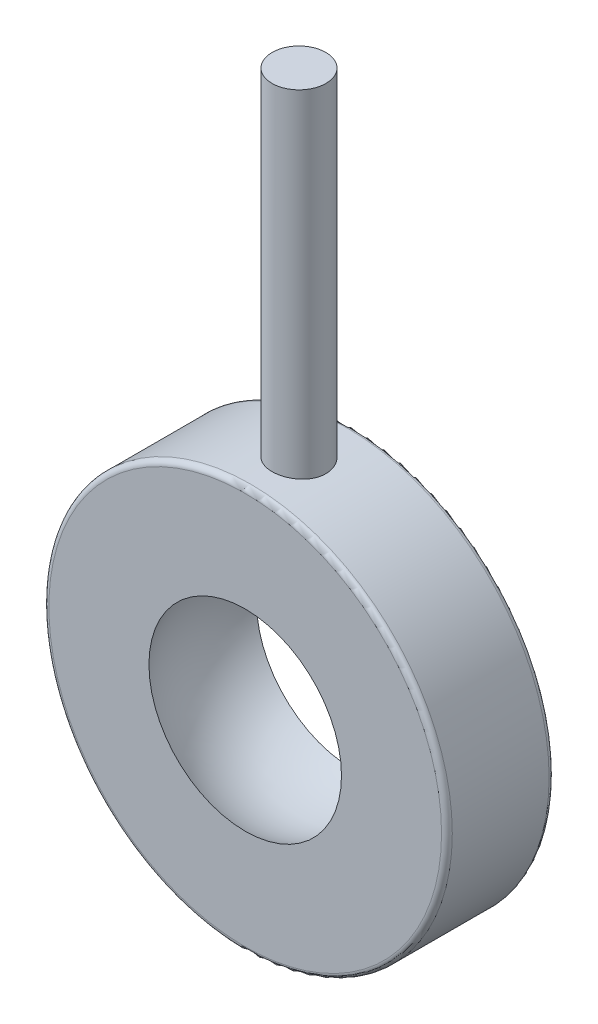
ISO-10303-21;
HEADER;
FILE_DESCRIPTION(('STEP AP214'),'2;1');
FILE_NAME('part.step','',(''),(''),'','','');
FILE_SCHEMA(('AUTOMOTIVE_DESIGN { 1 0 10303 214 1 1 1 1 }'));
ENDSEC;
DATA;
#1=APPLICATION_CONTEXT('core data for automotive mechanical design processes');
#2=APPLICATION_PROTOCOL_DEFINITION('international standard','automotive_design',2000,#1);
#3=PRODUCT_CONTEXT('',#1,'mechanical');
#4=PRODUCT('Part','Part','',(#3));
#5=PRODUCT_RELATED_PRODUCT_CATEGORY('part','',(#4));
#6=PRODUCT_DEFINITION_FORMATION('','',#4);
#7=PRODUCT_DEFINITION_CONTEXT('part definition',#1,'design');
#8=PRODUCT_DEFINITION('design','',#6,#7);
#9=PRODUCT_DEFINITION_SHAPE('','',#8);
#10=(LENGTH_UNIT() NAMED_UNIT(*) SI_UNIT(.MILLI.,.METRE.));
#11=(NAMED_UNIT(*) PLANE_ANGLE_UNIT() SI_UNIT($,.RADIAN.));
#12=(NAMED_UNIT(*) SI_UNIT($,.STERADIAN.) SOLID_ANGLE_UNIT());
#13=UNCERTAINTY_MEASURE_WITH_UNIT(LENGTH_MEASURE(1.E-05),#10,'distance_accuracy_value','');
#14=(GEOMETRIC_REPRESENTATION_CONTEXT(3) GLOBAL_UNCERTAINTY_ASSIGNED_CONTEXT((#13)) GLOBAL_UNIT_ASSIGNED_CONTEXT((#10,
#11,#12)) REPRESENTATION_CONTEXT('',''));
#15=CARTESIAN_POINT('',(0.,0.,0.));
#16=DIRECTION('',(0.,0.,1.));
#17=DIRECTION('',(1.,0.,0.));
#18=AXIS2_PLACEMENT_3D('',#15,#16,#17);
#19=CARTESIAN_POINT('',(0.,0.,20.));
#20=DIRECTION('',(0.,0.,-1.));
#21=DIRECTION('',(-1.,0.,0.));
#22=AXIS2_PLACEMENT_3D('',#19,#20,#21);
#23=CYLINDRICAL_SURFACE('',#22,75.);
#24=CARTESIAN_POINT('',(0.,0.,18.));
#25=DIRECTION('',(0.,0.,1.));
#26=DIRECTION('',(1.,0.,0.));
#27=AXIS2_PLACEMENT_3D('',#24,#25,#26);
#28=CIRCLE('',#27,75.);
#29=CARTESIAN_POINT('',(75.,0.,18.));
#30=VERTEX_POINT('',#29);
#31=EDGE_CURVE('E47',#30,#30,#28,.F.);
#32=ORIENTED_EDGE('',*,*,#31,.T.);
#33=EDGE_LOOP('',(#32));
#34=FACE_BOUND('',#33,.T.);
#35=CARTESIAN_POINT('',(0.,0.,-18.));
#36=DIRECTION('',(0.,0.,1.));
#37=DIRECTION('',(1.,0.,0.));
#38=AXIS2_PLACEMENT_3D('',#35,#36,#37);
#39=CIRCLE('',#38,75.);
#40=CARTESIAN_POINT('',(75.,0.,-18.));
#41=VERTEX_POINT('',#40);
#42=EDGE_CURVE('E51',#41,#41,#39,.T.);
#43=ORIENTED_EDGE('',*,*,#42,.T.);
#44=EDGE_LOOP('',(#43));
#45=FACE_BOUND('',#44,.T.);
#46=CARTESIAN_POINT('',(0.,75.,-10.));
#47=CARTESIAN_POINT('',(-0.279619716406535,75.0000012070515,-10.0000033923977));
#48=CARTESIAN_POINT('',(-0.559190351759265,74.9984332083861,-9.98826782734136));
#49=CARTESIAN_POINT('',(-1.11641921688895,74.9922076081366,-9.94141688074488));
#50=CARTESIAN_POINT('',(-1.39407700909204,74.9875493218885,-9.90629631817048));
#51=CARTESIAN_POINT('',(-1.94565039617829,74.9752668061268,-9.81288776594244));
#52=CARTESIAN_POINT('',(-2.21956240482985,74.9676399156737,-9.7545789902689));
#53=CARTESIAN_POINT('',(-2.76145578336895,74.9496354658181,-9.61522890265368));
#54=CARTESIAN_POINT('',(-3.02943703069307,74.9392578496273,-9.53418712139056));
#55=CARTESIAN_POINT('',(-3.55737734335785,74.916051954278,-9.35003582899592));
#56=CARTESIAN_POINT('',(-3.81734207530547,74.9032254545217,-9.24694233452308));
#57=CARTESIAN_POINT('',(-4.32763808166604,74.8754756289206,-9.0194009843396));
#58=CARTESIAN_POINT('',(-4.57796923253956,74.8605522761976,-8.89495285489238));
#59=CARTESIAN_POINT('',(-5.06721394197359,74.8290279942424,-8.62561909731318));
#60=CARTESIAN_POINT('',(-5.30612952593188,74.8124273642399,-8.48073711280309));
#61=CARTESIAN_POINT('',(-5.77094557458623,74.778008183031,-8.1715422272001));
#62=CARTESIAN_POINT('',(-5.99684595323996,74.7601896237748,-8.00722919767223));
#63=CARTESIAN_POINT('',(-6.43529763931791,74.7237285992153,-7.65935333014741));
#64=CARTESIAN_POINT('',(-6.6477676383944,74.7050820997237,-7.47568842837199));
#65=CARTESIAN_POINT('',(-7.05650448635232,74.6675824863102,-7.0911549335543));
#66=CARTESIAN_POINT('',(-7.2527712655371,74.6487293715,-6.89028626651918));
#67=CARTESIAN_POINT('',(-7.62774757858985,74.6113461986771,-6.47272832337968));
#68=CARTESIAN_POINT('',(-7.80645599031184,74.5928161613743,-6.25603803766469));
#69=CARTESIAN_POINT('',(-8.14504497656681,74.5566042763688,-5.80835655567108));
#70=CARTESIAN_POINT('',(-8.30492598085652,74.5389224093111,-5.57736568600307));
#71=CARTESIAN_POINT('',(-8.60531438636342,74.504842207492,-5.10176217616923));
#72=CARTESIAN_POINT('',(-8.74574434387781,74.4884491098742,-4.85710023717615));
#73=CARTESIAN_POINT('',(-9.00547981792014,74.4574942412595,-4.35669598140822));
#74=CARTESIAN_POINT('',(-9.12478526319585,74.4429324764397,-4.10095362726314));
#75=CARTESIAN_POINT('',(-9.34139305270841,74.4160620748674,-3.5802089413552));
#76=CARTESIAN_POINT('',(-9.43869613581775,74.4037533624565,-3.31520692089105));
#77=CARTESIAN_POINT('',(-9.61058011027943,74.3817468534644,-2.77782799611837));
#78=CARTESIAN_POINT('',(-9.68516114799469,74.3720490400652,-2.50545113932678));
#79=CARTESIAN_POINT('',(-9.81066575440311,74.3555971239215,-1.95691776019522));
#80=CARTESIAN_POINT('',(-9.86172720998308,74.348825878578,-1.68079329735067));
#81=CARTESIAN_POINT('',(-9.94045852889622,74.3383404807451,-1.12517177066657));
#82=CARTESIAN_POINT('',(-9.96812847535401,74.334626317392,-0.845674718815502));
#83=CARTESIAN_POINT('',(-9.99986657015993,74.3303634208185,-0.285330967482586));
#84=CARTESIAN_POINT('',(-10.003935670207,74.3298145599579,-0.0044843228798482));
#85=CARTESIAN_POINT('',(-9.9884436303598,74.3318979618101,0.556544013741018));
#86=CARTESIAN_POINT('',(-9.96888257352402,74.3345302133413,0.836725708092934));
#87=CARTESIAN_POINT('',(-9.90648350629231,74.3428716448243,1.39258506553653));
#88=CARTESIAN_POINT('',(-9.86379816927264,74.3485606412444,1.66828018702316));
#89=CARTESIAN_POINT('',(-9.75556991491202,74.362839042772,2.21506836510023));
#90=CARTESIAN_POINT('',(-9.69002711247965,74.3714284332987,2.48616144481877));
#91=CARTESIAN_POINT('',(-9.53656626884383,74.3912621428144,3.02184245400225));
#92=CARTESIAN_POINT('',(-9.44864787014626,74.4025065042216,3.2864302794589));
#93=CARTESIAN_POINT('',(-9.25107692739361,74.4273301969514,3.80724947764055));
#94=CARTESIAN_POINT('',(-9.14142428052967,74.4409095393191,4.06348081083043));
#95=CARTESIAN_POINT('',(-8.90079707415186,74.4700646992385,4.56659736655158));
#96=CARTESIAN_POINT('',(-8.76975689821135,74.4856466283773,4.81345085037148));
#97=CARTESIAN_POINT('',(-8.48753376903345,74.51833291186,5.29525425098687));
#98=CARTESIAN_POINT('',(-8.33635078936688,74.5354372682015,5.53020415216323));
#99=CARTESIAN_POINT('',(-8.01489842453545,74.5706881907582,5.98659441102554));
#100=CARTESIAN_POINT('',(-7.84462820048524,74.5888348027634,6.20803417427924));
#101=CARTESIAN_POINT('',(-7.48619078801042,74.6256617756626,6.63587446530522));
#102=CARTESIAN_POINT('',(-7.29802350511339,74.6443421393736,6.84227491367997));
#103=CARTESIAN_POINT('',(-6.90353914836961,74.6818632648854,7.24018307572474));
#104=CARTESIAN_POINT('',(-6.69709064011064,74.7007041298098,7.43156050097077));
#105=CARTESIAN_POINT('',(-6.26877092927642,74.7378666401358,7.79625726007098));
#106=CARTESIAN_POINT('',(-6.04689964094186,74.7561882826494,7.9695764934981));
#107=CARTESIAN_POINT('',(-5.58927967789114,74.7917950905406,8.29693299256007));
#108=CARTESIAN_POINT('',(-5.35353091917046,74.8090802496428,8.45097014145701));
#109=CARTESIAN_POINT('',(-4.86980533586423,74.8421255450883,8.73866033207255));
#110=CARTESIAN_POINT('',(-4.62182853870506,74.8578856848517,8.87231341950802));
#111=CARTESIAN_POINT('',(-4.11528292267449,74.8874410646486,9.11831979126875));
#112=CARTESIAN_POINT('',(-3.85670971755911,74.901235480199,9.23066414458084));
#113=CARTESIAN_POINT('',(-3.33090046417497,74.9264597562814,9.43315807583885));
#114=CARTESIAN_POINT('',(-3.06366440566221,74.9378896140173,9.52330762753788));
#115=CARTESIAN_POINT('',(-2.52245103799736,74.9580586777726,9.68073658847149));
#116=CARTESIAN_POINT('',(-2.2484740229211,74.9667980009434,9.74801699348767));
#117=CARTESIAN_POINT('',(-1.69574122707741,74.9813369193078,9.85920529988417));
#118=CARTESIAN_POINT('',(-1.41698547825027,74.987136534142,9.90311335741876));
#119=CARTESIAN_POINT('',(-0.85884171502717,74.9955978558703,9.96698012875527));
#120=CARTESIAN_POINT('',(-0.579474551480974,74.9982830412201,9.98711805685234));
#121=CARTESIAN_POINT('',(-0.0200236329046552,75.0005189604191,10.0038949721797));
#122=CARTESIAN_POINT('',(0.260060118508236,75.0000697100594,10.0005340777956));
#123=CARTESIAN_POINT('',(0.818929906214981,74.9960495081665,9.97033922625838));
#124=CARTESIAN_POINT('',(1.09771597241429,74.9924786289335,9.94350581275431));
#125=CARTESIAN_POINT('',(1.65200207000453,74.9823160890031,9.86656866179517));
#126=CARTESIAN_POINT('',(1.92750210349212,74.9757244302332,9.81646493918856));
#127=CARTESIAN_POINT('',(2.47222254979644,74.9597364320507,9.6935946220001));
#128=CARTESIAN_POINT('',(2.7414627366857,74.9503507705404,9.62091426388232));
#129=CARTESIAN_POINT('',(3.27284235726101,74.9290278451886,9.45336512583319));
#130=CARTESIAN_POINT('',(3.53498181499396,74.9170905899896,9.35849642105403));
#131=CARTESIAN_POINT('',(4.05029728746842,74.8909984472783,9.14727405572724));
#132=CARTESIAN_POINT('',(4.30347457729918,74.8768438768012,9.03092346626723));
#133=CARTESIAN_POINT('',(4.79924236531035,74.8467031833699,8.77751678752504));
#134=CARTESIAN_POINT('',(5.04182912273535,74.8307164203677,8.64045345720924));
#135=CARTESIAN_POINT('',(5.51599422388902,74.7972634767049,8.34578711139781));
#136=CARTESIAN_POINT('',(5.74750256409731,74.7797894418158,8.1880723364509));
#137=CARTESIAN_POINT('',(6.19643401690767,74.7439290076531,7.85382215730966));
#138=CARTESIAN_POINT('',(6.41385704482018,74.7255426028952,7.67728663997033));
#139=CARTESIAN_POINT('',(6.83316221015274,74.6883673285822,7.30658738718975));
#140=CARTESIAN_POINT('',(7.0350410398467,74.6695783744481,7.11241991881148));
#141=CARTESIAN_POINT('',(7.42174467379806,74.6321340967488,6.70790376909727));
#142=CARTESIAN_POINT('',(7.60657530820146,74.6134787295277,6.49756066497197));
#143=CARTESIAN_POINT('',(7.95915417081043,74.5766954352973,6.06062667526092));
#144=CARTESIAN_POINT('',(8.12677983770482,74.5585718721111,5.83393650085427));
#145=CARTESIAN_POINT('',(8.44233678865546,74.5235007396666,5.36715158120608));
#146=CARTESIAN_POINT('',(8.59026797439738,74.506553176279,5.12705676905743));
#147=CARTESIAN_POINT('',(8.86536998117221,74.4743204414776,4.6351511556));
#148=CARTESIAN_POINT('',(8.99254112251892,74.4590352444159,4.38334053513548));
#149=CARTESIAN_POINT('',(9.22519828092124,74.4305680562507,3.86977833159328));
#150=CARTESIAN_POINT('',(9.3306844004032,74.4173860552131,3.60802679547712));
#151=CARTESIAN_POINT('',(9.518916022133,74.3935428577647,3.07722298243401));
#152=CARTESIAN_POINT('',(9.60172718392501,74.3828743957286,2.80819431788257));
#153=CARTESIAN_POINT('',(9.74439916306694,74.3643185033919,2.26402367489205));
#154=CARTESIAN_POINT('',(9.80426000847051,74.3564310696919,1.9888817039261));
#155=CARTESIAN_POINT('',(9.90057777843488,74.3436676787331,1.43447451357626));
#156=CARTESIAN_POINT('',(9.93703575499221,74.3387915861101,1.15520948010803));
#157=CARTESIAN_POINT('',(9.98627459257247,74.3321931580462,0.594563303608569));
#158=CARTESIAN_POINT('',(9.99905559074115,74.3304708043377,0.313182172844039));
#159=CARTESIAN_POINT('',(10.000836439396,74.330231194586,-0.247427146871469));
#160=CARTESIAN_POINT('',(9.99002372423676,74.3316886771164,-0.526654747900826));
#161=CARTESIAN_POINT('',(9.94508084096933,74.3377150547088,-1.08319182065992));
#162=CARTESIAN_POINT('',(9.91095080408146,74.3422839322611,-1.36050130317516));
#163=CARTESIAN_POINT('',(9.81962911533225,74.3544013589413,-1.91122852119838));
#164=CARTESIAN_POINT('',(9.76243754406853,74.3619498976554,-2.18464627030409));
#165=CARTESIAN_POINT('',(9.62541751382016,74.3798097942894,-2.72565680122852));
#166=CARTESIAN_POINT('',(9.54558900448568,74.3901211583543,-2.99324957008969));
#167=CARTESIAN_POINT('',(9.36392490111063,74.4132063711849,-3.52060365753774));
#168=CARTESIAN_POINT('',(9.26209981768597,74.4259790435507,-3.78036864915102));
#169=CARTESIAN_POINT('',(9.03715761064697,74.4536272750217,-4.29039200716886));
#170=CARTESIAN_POINT('',(8.91404050976295,74.468502831882,-4.54065038372189));
#171=CARTESIAN_POINT('',(8.64742107822786,74.4999336482931,-5.02988078737508));
#172=CARTESIAN_POINT('',(8.50392307410038,74.5164885511344,-5.26885519556255));
#173=CARTESIAN_POINT('',(8.19746322335711,74.5508240822604,-5.73403968531539));
#174=CARTESIAN_POINT('',(8.03449265102683,74.5686052585214,-5.96024397719729));
#175=CARTESIAN_POINT('',(7.68896377124455,74.6050282016065,-6.39989043135431));
#176=CARTESIAN_POINT('',(7.50626610717593,74.6236754785316,-6.61322262770322));
#177=CARTESIAN_POINT('',(7.12367161173551,74.6611694400287,-7.02367299975107));
#178=CARTESIAN_POINT('',(6.92378206982238,74.680016037144,-7.22079797873578));
#179=CARTESIAN_POINT('',(6.50803092991312,74.7173949161725,-7.59764996818853));
#180=CARTESIAN_POINT('',(6.29216212142672,74.7359270514941,-7.77736903892833));
#181=CARTESIAN_POINT('',(5.84603335633378,74.7721470132355,-8.11804572582927));
#182=CARTESIAN_POINT('',(5.61577358197094,74.7898348503422,-8.27900357950396));
#183=CARTESIAN_POINT('',(5.14142898395728,74.8239432381203,-8.58167832911045));
#184=CARTESIAN_POINT('',(4.8972884105166,74.8403579452544,-8.72330853716676));
#185=CARTESIAN_POINT('',(4.39782524224943,74.8713679221156,-8.9854707031445));
#186=CARTESIAN_POINT('',(4.14250280390369,74.8859632172929,-9.10600295619614));
#187=CARTESIAN_POINT('',(3.62271944611508,74.9129063510595,-9.32498517527485));
#188=CARTESIAN_POINT('',(3.35826739233886,74.9252563008749,-9.42345590549698));
#189=CARTESIAN_POINT('',(2.82197823359799,74.9473715001512,-9.59770504733728));
#190=CARTESIAN_POINT('',(2.55014285896011,74.9571373495462,-9.67348872660158));
#191=CARTESIAN_POINT('',(1.9030986725915,74.9767750395936,-9.8246822567323));
#192=CARTESIAN_POINT('',(1.52553616139415,74.9854472385771,-9.89035696515225));
#193=CARTESIAN_POINT('',(0.765285107177902,74.9970588677068,-9.97801332321165));
#194=CARTESIAN_POINT('',(0.38259660940573,74.9999983484219,-9.99999535826768));
#195=CARTESIAN_POINT('',(0.,75.,-10.));
#196=B_SPLINE_CURVE_WITH_KNOTS('',3,(#46,#47,#48,#49,#50,#51,#52,#53,#54,#55,#56,#57,#58,#59,
#60,#61,#62,#63,#64,#65,#66,#67,#68,#69,#70,#71,#72,#73,#74,#75,#76,#77,#78,#79,#80,#81,#82,#83,
#84,#85,#86,#87,#88,#89,#90,#91,#92,#93,#94,#95,#96,#97,#98,#99,#100,#101,#102,#103,#104,#105,
#106,#107,#108,#109,#110,#111,#112,#113,#114,#115,#116,#117,#118,#119,#120,#121,#122,#123,#124,
#125,#126,#127,#128,#129,#130,#131,#132,#133,#134,#135,#136,#137,#138,#139,#140,#141,#142,#143,
#144,#145,#146,#147,#148,#149,#150,#151,#152,#153,#154,#155,#156,#157,#158,#159,#160,#161,#162,
#163,#164,#165,#166,#167,#168,#169,#170,#171,#172,#173,#174,#175,#176,#177,#178,#179,#180,#181,
#182,#183,#184,#185,#186,#187,#188,#189,#190,#191,#192,#193,#194,#195),.UNSPECIFIED.,.T.,.F.,(4,
2,2,2,2,2,2,2,2,2,2,2,2,2,2,2,2,2,2,2,2,2,2,2,2,2,2,2,2,2,2,2,2,2,2,2,2,2,2,2,2,2,2,2,2,2,2,2,2,
2,2,2,2,2,2,2,2,2,2,2,2,2,2,2,2,2,2,2,2,2,2,2,2,2,4),(0.,0.838524241119911,1.67723432228739,
2.51669792781775,3.35617886529557,4.19505212671737,5.03393614212582,5.87267076228796,
6.71141092661273,7.55481999152266,8.39823268409013,9.24169924370328,10.0851465465111,
10.931860991401,11.7785782921742,12.6252671546797,13.4719505631659,14.3136049321686,
15.1552563102355,15.9968737486607,16.8384882288647,17.6746126613095,18.5107328904676,
19.346866479128,20.1830040230207,21.0217567769291,21.8605106313672,22.6993013635423,
23.5380965236507,24.3835068143974,25.2289218064754,26.0743419166322,26.9197601306742,
27.7655319010118,28.6113046715277,29.4570406101976,30.3027708983041,31.1420832473239,
31.9813913679424,32.8206800497891,33.6599681960984,34.4960891183103,35.3322072086111,
36.1682058584401,37.0044974467368,37.8455178536597,38.6865433168455,39.5277472541784,
40.3686624414341,41.2152036830642,42.0617491504474,42.9082815549571,43.7548099608906,
44.598860521096,45.4429100495603,46.2869216339858,47.1309283295713,47.9682544521221,
48.8055758625855,49.6428943467248,50.4802146932709,51.3171358248189,52.1540560629157,
52.9907989017062,53.8279181035595,54.6713946664566,55.5145153369487,56.3580188043681,
57.2015115920288,58.0486712842236,58.8958191249191,59.7421662530566,60.5883167174148,
61.7356584201595,62.8829900020661),.UNSPECIFIED.);
#197=CARTESIAN_POINT('',(0.,75.,-10.));
#198=VERTEX_POINT('',#197);
#199=EDGE_CURVE('E59',#198,#198,#196,.T.);
#200=ORIENTED_EDGE('',*,*,#199,.F.);
#201=EDGE_LOOP('',(#200));
#202=FACE_BOUND('',#201,.T.);
#203=ADVANCED_FACE('F39',(#34,#45,#202),#23,.T.);
#204=CARTESIAN_POINT('',(0.,0.,20.));
#205=DIRECTION('',(0.,0.,1.));
#206=DIRECTION('',(1.,0.,0.));
#207=AXIS2_PLACEMENT_3D('',#204,#205,#206);
#208=PLANE('',#207);
#209=CARTESIAN_POINT('',(0.,0.,20.));
#210=DIRECTION('',(0.,0.,1.));
#211=DIRECTION('',(1.,0.,0.));
#212=AXIS2_PLACEMENT_3D('',#209,#210,#211);
#213=CIRCLE('',#212,35.7967879145601);
#214=CARTESIAN_POINT('',(35.7967879145601,0.,20.));
#215=VERTEX_POINT('',#214);
#216=EDGE_CURVE('E120',#215,#215,#213,.F.);
#217=ORIENTED_EDGE('',*,*,#216,.T.);
#218=EDGE_LOOP('',(#217));
#219=FACE_BOUND('',#218,.T.);
#220=CARTESIAN_POINT('',(0.,0.,20.));
#221=DIRECTION('',(0.,0.,1.));
#222=DIRECTION('',(1.,0.,0.));
#223=AXIS2_PLACEMENT_3D('',#220,#221,#222);
#224=CIRCLE('',#223,73.);
#225=CARTESIAN_POINT('',(73.,0.,20.));
#226=VERTEX_POINT('',#225);
#227=EDGE_CURVE('E56',#226,#226,#224,.T.);
#228=ORIENTED_EDGE('',*,*,#227,.T.);
#229=EDGE_LOOP('',(#228));
#230=FACE_BOUND('',#229,.T.);
#231=ADVANCED_FACE('F80',(#219,#230),#208,.T.);
#232=CARTESIAN_POINT('',(0.,0.,-20.));
#233=DIRECTION('',(0.,0.,1.));
#234=DIRECTION('',(1.,0.,0.));
#235=AXIS2_PLACEMENT_3D('',#232,#233,#234);
#236=PLANE('',#235);
#237=CARTESIAN_POINT('',(0.,0.,-20.));
#238=DIRECTION('',(0.,0.,1.));
#239=DIRECTION('',(1.,0.,0.));
#240=AXIS2_PLACEMENT_3D('',#237,#238,#239);
#241=CIRCLE('',#240,35.7967879145601);
#242=CARTESIAN_POINT('',(35.7967879145601,0.,-20.));
#243=VERTEX_POINT('',#242);
#244=EDGE_CURVE('E43',#243,#243,#241,.F.);
#245=ORIENTED_EDGE('',*,*,#244,.F.);
#246=EDGE_LOOP('',(#245));
#247=FACE_BOUND('',#246,.T.);
#248=CARTESIAN_POINT('',(0.,0.,-20.));
#249=DIRECTION('',(0.,0.,1.));
#250=DIRECTION('',(1.,0.,0.));
#251=AXIS2_PLACEMENT_3D('',#248,#249,#250);
#252=CIRCLE('',#251,73.);
#253=CARTESIAN_POINT('',(73.,0.,-20.));
#254=VERTEX_POINT('',#253);
#255=EDGE_CURVE('E10',#254,#254,#252,.F.);
#256=ORIENTED_EDGE('',*,*,#255,.T.);
#257=EDGE_LOOP('',(#256));
#258=FACE_BOUND('',#257,.T.);
#259=ADVANCED_FACE('F77',(#247,#258),#236,.F.);
#260=CARTESIAN_POINT('',(0.,200.,0.));
#261=DIRECTION('',(0.,-1.,0.));
#262=DIRECTION('',(0.,0.,-1.));
#263=AXIS2_PLACEMENT_3D('',#260,#261,#262);
#264=CYLINDRICAL_SURFACE('',#263,10.);
#265=CARTESIAN_POINT('',(0.,200.,0.));
#266=DIRECTION('',(0.,1.,0.));
#267=DIRECTION('',(0.,0.,1.));
#268=AXIS2_PLACEMENT_3D('',#265,#266,#267);
#269=CIRCLE('',#268,10.);
#270=CARTESIAN_POINT('',(0.,200.,10.));
#271=VERTEX_POINT('',#270);
#272=EDGE_CURVE('E67',#271,#271,#269,.T.);
#273=ORIENTED_EDGE('',*,*,#272,.F.);
#274=EDGE_LOOP('',(#273));
#275=FACE_BOUND('',#274,.T.);
#276=ORIENTED_EDGE('',*,*,#199,.T.);
#277=EDGE_LOOP('',(#276));
#278=FACE_BOUND('',#277,.T.);
#279=ADVANCED_FACE('F71',(#275,#278),#264,.T.);
#280=CARTESIAN_POINT('',(0.,200.,0.));
#281=DIRECTION('',(0.,1.,0.));
#282=DIRECTION('',(0.,0.,1.));
#283=AXIS2_PLACEMENT_3D('',#280,#281,#282);
#284=PLANE('',#283);
#285=ORIENTED_EDGE('',*,*,#272,.T.);
#286=EDGE_LOOP('',(#285));
#287=FACE_BOUND('',#286,.T.);
#288=ADVANCED_FACE('F76',(#287),#284,.T.);
#289=CARTESIAN_POINT('',(0.,0.,18.));
#290=DIRECTION('',(0.,0.,1.));
#291=DIRECTION('',(1.,0.,0.));
#292=AXIS2_PLACEMENT_3D('',#289,#290,#291);
#293=TOROIDAL_SURFACE('',#292,73.,2.);
#294=ORIENTED_EDGE('',*,*,#31,.F.);
#295=EDGE_LOOP('',(#294));
#296=FACE_BOUND('',#295,.T.);
#297=ORIENTED_EDGE('',*,*,#227,.F.);
#298=EDGE_LOOP('',(#297));
#299=FACE_BOUND('',#298,.T.);
#300=ADVANCED_FACE('F104',(#296,#299),#293,.T.);
#301=CARTESIAN_POINT('',(0.,0.,-18.));
#302=DIRECTION('',(0.,0.,1.));
#303=DIRECTION('',(1.,0.,0.));
#304=AXIS2_PLACEMENT_3D('',#301,#302,#303);
#305=TOROIDAL_SURFACE('',#304,73.,2.);
#306=ORIENTED_EDGE('',*,*,#255,.F.);
#307=EDGE_LOOP('',(#306));
#308=FACE_BOUND('',#307,.T.);
#309=ORIENTED_EDGE('',*,*,#42,.F.);
#310=EDGE_LOOP('',(#309));
#311=FACE_BOUND('',#310,.T.);
#312=ADVANCED_FACE('F41',(#308,#311),#305,.T.);
#313=CARTESIAN_POINT('',(0.,0.,0.));
#314=DIRECTION('',(0.,-1.,0.));
#315=DIRECTION('',(-1.,0.,0.));
#316=AXIS2_PLACEMENT_3D('',#313,#314,#315);
#317=SPHERICAL_SURFACE('',#316,41.005);
#318=CARTESIAN_POINT('',(0.,0.,0.));
#319=DIRECTION('',(0.,0.,1.));
#320=DIRECTION('',(1.,0.,0.));
#321=AXIS2_PLACEMENT_3D('',#318,#319,#320);
#322=SPHERICAL_SURFACE('',#321,41.005);
#323=ORIENTED_EDGE('',*,*,#216,.F.);
#324=EDGE_LOOP('',(#323));
#325=FACE_BOUND('',#324,.T.);
#326=ORIENTED_EDGE('',*,*,#244,.T.);
#327=EDGE_LOOP('',(#326));
#328=FACE_BOUND('',#327,.T.);
#329=ADVANCED_FACE('F103',(#325,#328),#322,.F.);
#330=CLOSED_SHELL('',(#203,#231,#259,#279,#288,#300,#312,#329));
#331=MANIFOLD_SOLID_BREP('B2',#330);
#332=ADVANCED_BREP_SHAPE_REPRESENTATION('',(#18,#331),#14);
#333=SHAPE_DEFINITION_REPRESENTATION(#9,#332);
ENDSEC;
END-ISO-10303-21;
